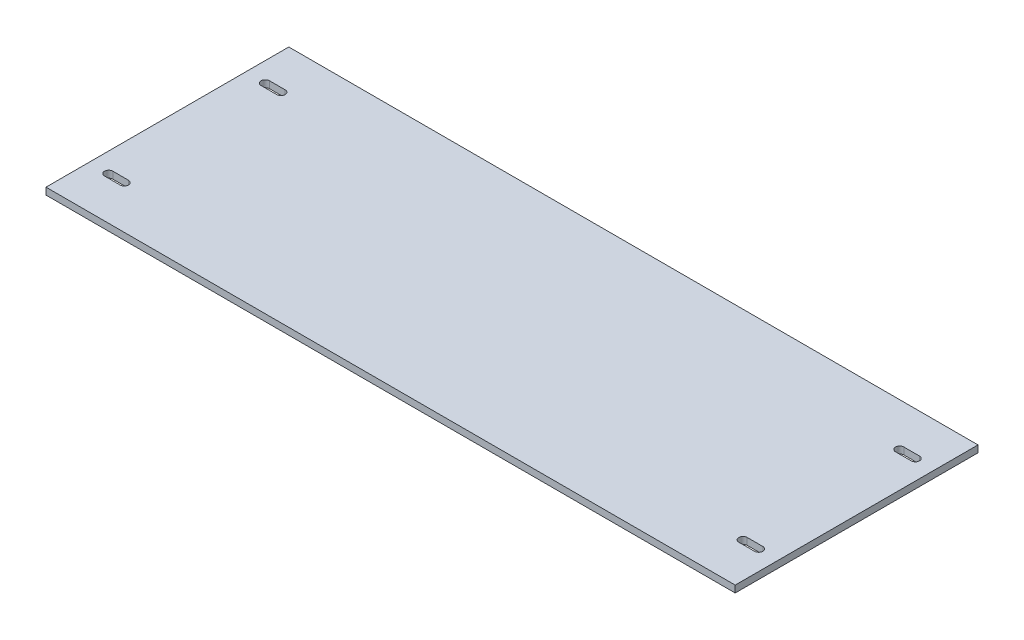
ISO-10303-21;
HEADER;
FILE_DESCRIPTION(('STEP AP214'),'2;1');
FILE_NAME('part.step','',(''),(''),'','','');
FILE_SCHEMA(('AUTOMOTIVE_DESIGN { 1 0 10303 214 1 1 1 1 }'));
ENDSEC;
DATA;
#1=APPLICATION_CONTEXT('core data for automotive mechanical design processes');
#2=APPLICATION_PROTOCOL_DEFINITION('international standard','automotive_design',2000,#1);
#3=PRODUCT_CONTEXT('',#1,'mechanical');
#4=PRODUCT('Part','Part','',(#3));
#5=PRODUCT_RELATED_PRODUCT_CATEGORY('part','',(#4));
#6=PRODUCT_DEFINITION_FORMATION('','',#4);
#7=PRODUCT_DEFINITION_CONTEXT('part definition',#1,'design');
#8=PRODUCT_DEFINITION('design','',#6,#7);
#9=PRODUCT_DEFINITION_SHAPE('','',#8);
#10=(LENGTH_UNIT() NAMED_UNIT(*) SI_UNIT(.MILLI.,.METRE.));
#11=(NAMED_UNIT(*) PLANE_ANGLE_UNIT() SI_UNIT($,.RADIAN.));
#12=(NAMED_UNIT(*) SI_UNIT($,.STERADIAN.) SOLID_ANGLE_UNIT());
#13=UNCERTAINTY_MEASURE_WITH_UNIT(LENGTH_MEASURE(1.E-05),#10,'distance_accuracy_value','');
#14=(GEOMETRIC_REPRESENTATION_CONTEXT(3) GLOBAL_UNCERTAINTY_ASSIGNED_CONTEXT((#13)) GLOBAL_UNIT_ASSIGNED_CONTEXT((#10,
#11,#12)) REPRESENTATION_CONTEXT('',''));
#15=CARTESIAN_POINT('',(0.,0.,0.));
#16=DIRECTION('',(0.,0.,1.));
#17=DIRECTION('',(1.,0.,0.));
#18=AXIS2_PLACEMENT_3D('',#15,#16,#17);
#19=CARTESIAN_POINT('',(0.,5.588,0.));
#20=DIRECTION('',(0.,-1.,0.));
#21=DIRECTION('',(0.,0.,-1.));
#22=AXIS2_PLACEMENT_3D('',#19,#20,#21);
#23=PLANE('',#22);
#24=CARTESIAN_POINT('',(542.925,5.588,-161.925));
#25=DIRECTION('',(0.,1.,0.));
#26=DIRECTION('',(0.,0.,1.));
#27=AXIS2_PLACEMENT_3D('',#24,#25,#26);
#28=CIRCLE('',#27,3.3782);
#29=CARTESIAN_POINT('',(542.925,5.588,-158.5468));
#30=VERTEX_POINT('',#29);
#31=CARTESIAN_POINT('',(542.925,5.588,-165.3032));
#32=VERTEX_POINT('',#31);
#33=EDGE_CURVE('E206',#30,#32,#28,.T.);
#34=ORIENTED_EDGE('',*,*,#33,.F.);
#35=DIRECTION('',(1.,0.,0.));
#36=VECTOR('',#35,1.);
#37=CARTESIAN_POINT('',(542.925,5.588,-158.5468));
#38=LINE('',#37,#36);
#39=CARTESIAN_POINT('',(530.225,5.588,-158.5468));
#40=VERTEX_POINT('',#39);
#41=EDGE_CURVE('E214',#40,#30,#38,.T.);
#42=ORIENTED_EDGE('',*,*,#41,.F.);
#43=CARTESIAN_POINT('',(530.225,5.588,-161.925));
#44=DIRECTION('',(0.,1.,0.));
#45=DIRECTION('',(0.,0.,1.));
#46=AXIS2_PLACEMENT_3D('',#43,#44,#45);
#47=CIRCLE('',#46,3.3782);
#48=CARTESIAN_POINT('',(530.225,5.588,-165.3032));
#49=VERTEX_POINT('',#48);
#50=EDGE_CURVE('E211',#49,#40,#47,.T.);
#51=ORIENTED_EDGE('',*,*,#50,.F.);
#52=DIRECTION('',(-1.,0.,0.));
#53=VECTOR('',#52,1.);
#54=CARTESIAN_POINT('',(542.925,5.588,-165.3032));
#55=LINE('',#54,#53);
#56=EDGE_CURVE('E208',#32,#49,#55,.T.);
#57=ORIENTED_EDGE('',*,*,#56,.F.);
#58=EDGE_LOOP('',(#34,#42,#51,#57));
#59=FACE_BOUND('',#58,.T.);
#60=CARTESIAN_POINT('',(15.875,5.588,-34.925));
#61=DIRECTION('',(0.,1.,0.));
#62=DIRECTION('',(0.,0.,1.));
#63=AXIS2_PLACEMENT_3D('',#60,#61,#62);
#64=CIRCLE('',#63,3.3782);
#65=CARTESIAN_POINT('',(15.875,5.588,-38.3032));
#66=VERTEX_POINT('',#65);
#67=CARTESIAN_POINT('',(15.875,5.588,-31.5468));
#68=VERTEX_POINT('',#67);
#69=EDGE_CURVE('E268',#66,#68,#64,.T.);
#70=ORIENTED_EDGE('',*,*,#69,.F.);
#71=DIRECTION('',(-1.,0.,0.));
#72=VECTOR('',#71,1.);
#73=CARTESIAN_POINT('',(15.875,5.588,-38.3032));
#74=LINE('',#73,#72);
#75=CARTESIAN_POINT('',(28.575,5.588,-38.3032));
#76=VERTEX_POINT('',#75);
#77=EDGE_CURVE('E276',#76,#66,#74,.T.);
#78=ORIENTED_EDGE('',*,*,#77,.F.);
#79=CARTESIAN_POINT('',(28.575,5.588,-34.925));
#80=DIRECTION('',(0.,1.,0.));
#81=DIRECTION('',(0.,0.,1.));
#82=AXIS2_PLACEMENT_3D('',#79,#80,#81);
#83=CIRCLE('',#82,3.3782);
#84=CARTESIAN_POINT('',(28.575,5.588,-31.5468));
#85=VERTEX_POINT('',#84);
#86=EDGE_CURVE('E273',#85,#76,#83,.T.);
#87=ORIENTED_EDGE('',*,*,#86,.F.);
#88=DIRECTION('',(1.,0.,0.));
#89=VECTOR('',#88,1.);
#90=CARTESIAN_POINT('',(15.875,5.588,-31.5468));
#91=LINE('',#90,#89);
#92=EDGE_CURVE('E270',#68,#85,#91,.T.);
#93=ORIENTED_EDGE('',*,*,#92,.F.);
#94=EDGE_LOOP('',(#70,#78,#87,#93));
#95=FACE_BOUND('',#94,.T.);
#96=DIRECTION('',(0.,0.,1.));
#97=VECTOR('',#96,1.);
#98=CARTESIAN_POINT('',(0.,5.588,0.));
#99=LINE('',#98,#97);
#100=CARTESIAN_POINT('',(0.,5.588,-196.85));
#101=VERTEX_POINT('',#100);
#102=CARTESIAN_POINT('',(0.,5.588,0.));
#103=VERTEX_POINT('',#102);
#104=EDGE_CURVE('E299',#101,#103,#99,.T.);
#105=ORIENTED_EDGE('',*,*,#104,.T.);
#106=DIRECTION('',(1.,0.,0.));
#107=VECTOR('',#106,1.);
#108=CARTESIAN_POINT('',(0.,5.588,0.));
#109=LINE('',#108,#107);
#110=CARTESIAN_POINT('',(558.8,5.588,0.));
#111=VERTEX_POINT('',#110);
#112=EDGE_CURVE('E302',#103,#111,#109,.T.);
#113=ORIENTED_EDGE('',*,*,#112,.T.);
#114=DIRECTION('',(0.,0.,-1.));
#115=VECTOR('',#114,1.);
#116=CARTESIAN_POINT('',(558.8,5.588,0.));
#117=LINE('',#116,#115);
#118=CARTESIAN_POINT('',(558.8,5.588,-196.85));
#119=VERTEX_POINT('',#118);
#120=EDGE_CURVE('E305',#111,#119,#117,.T.);
#121=ORIENTED_EDGE('',*,*,#120,.T.);
#122=DIRECTION('',(-1.,0.,0.));
#123=VECTOR('',#122,1.);
#124=CARTESIAN_POINT('',(0.,5.588,-196.85));
#125=LINE('',#124,#123);
#126=EDGE_CURVE('E307',#119,#101,#125,.T.);
#127=ORIENTED_EDGE('',*,*,#126,.T.);
#128=EDGE_LOOP('',(#105,#113,#121,#127));
#129=FACE_BOUND('',#128,.T.);
#130=CARTESIAN_POINT('',(15.875,5.588,-161.925));
#131=DIRECTION('',(0.,1.,0.));
#132=DIRECTION('',(0.,0.,1.));
#133=AXIS2_PLACEMENT_3D('',#130,#131,#132);
#134=CIRCLE('',#133,3.3782);
#135=CARTESIAN_POINT('',(15.875,5.588,-165.3032));
#136=VERTEX_POINT('',#135);
#137=CARTESIAN_POINT('',(15.875,5.588,-158.5468));
#138=VERTEX_POINT('',#137);
#139=EDGE_CURVE('E237',#136,#138,#134,.T.);
#140=ORIENTED_EDGE('',*,*,#139,.F.);
#141=DIRECTION('',(-1.,0.,0.));
#142=VECTOR('',#141,1.);
#143=CARTESIAN_POINT('',(15.875,5.588,-165.3032));
#144=LINE('',#143,#142);
#145=CARTESIAN_POINT('',(28.575,5.588,-165.3032));
#146=VERTEX_POINT('',#145);
#147=EDGE_CURVE('E245',#146,#136,#144,.T.);
#148=ORIENTED_EDGE('',*,*,#147,.F.);
#149=CARTESIAN_POINT('',(28.575,5.588,-161.925));
#150=DIRECTION('',(0.,1.,0.));
#151=DIRECTION('',(0.,0.,1.));
#152=AXIS2_PLACEMENT_3D('',#149,#150,#151);
#153=CIRCLE('',#152,3.3782);
#154=CARTESIAN_POINT('',(28.575,5.588,-158.5468));
#155=VERTEX_POINT('',#154);
#156=EDGE_CURVE('E242',#155,#146,#153,.T.);
#157=ORIENTED_EDGE('',*,*,#156,.F.);
#158=DIRECTION('',(1.,0.,0.));
#159=VECTOR('',#158,1.);
#160=CARTESIAN_POINT('',(15.875,5.588,-158.5468));
#161=LINE('',#160,#159);
#162=EDGE_CURVE('E239',#138,#155,#161,.T.);
#163=ORIENTED_EDGE('',*,*,#162,.F.);
#164=EDGE_LOOP('',(#140,#148,#157,#163));
#165=FACE_BOUND('',#164,.T.);
#166=CARTESIAN_POINT('',(542.925,5.588,-34.925));
#167=DIRECTION('',(0.,1.,0.));
#168=DIRECTION('',(0.,0.,1.));
#169=AXIS2_PLACEMENT_3D('',#166,#167,#168);
#170=CIRCLE('',#169,3.37819999999999);
#171=CARTESIAN_POINT('',(542.925,5.588,-31.5468));
#172=VERTEX_POINT('',#171);
#173=CARTESIAN_POINT('',(542.925,5.588,-38.3032));
#174=VERTEX_POINT('',#173);
#175=EDGE_CURVE('E170',#172,#174,#170,.T.);
#176=ORIENTED_EDGE('',*,*,#175,.F.);
#177=DIRECTION('',(1.,0.,0.));
#178=VECTOR('',#177,1.);
#179=CARTESIAN_POINT('',(542.925,5.588,-31.5468));
#180=LINE('',#179,#178);
#181=CARTESIAN_POINT('',(530.225,5.588,-31.5468));
#182=VERTEX_POINT('',#181);
#183=EDGE_CURVE('E192',#182,#172,#180,.T.);
#184=ORIENTED_EDGE('',*,*,#183,.F.);
#185=CARTESIAN_POINT('',(530.225,5.588,-34.925));
#186=DIRECTION('',(0.,1.,0.));
#187=DIRECTION('',(0.,0.,1.));
#188=AXIS2_PLACEMENT_3D('',#185,#186,#187);
#189=CIRCLE('',#188,3.37819999999999);
#190=CARTESIAN_POINT('',(530.225,5.588,-38.3032));
#191=VERTEX_POINT('',#190);
#192=EDGE_CURVE('E190',#191,#182,#189,.T.);
#193=ORIENTED_EDGE('',*,*,#192,.F.);
#194=DIRECTION('',(-1.,0.,0.));
#195=VECTOR('',#194,1.);
#196=CARTESIAN_POINT('',(542.925,5.588,-38.3032));
#197=LINE('',#196,#195);
#198=EDGE_CURVE('E178',#174,#191,#197,.T.);
#199=ORIENTED_EDGE('',*,*,#198,.F.);
#200=EDGE_LOOP('',(#176,#184,#193,#199));
#201=FACE_BOUND('',#200,.T.);
#202=ADVANCED_FACE('F33',(#59,#95,#129,#165,#201),#23,.F.);
#203=CARTESIAN_POINT('',(0.,0.,0.));
#204=DIRECTION('',(0.,-1.,0.));
#205=DIRECTION('',(0.,0.,-1.));
#206=AXIS2_PLACEMENT_3D('',#203,#204,#205);
#207=PLANE('',#206);
#208=DIRECTION('',(0.,0.,1.));
#209=VECTOR('',#208,1.);
#210=CARTESIAN_POINT('',(0.,0.,0.));
#211=LINE('',#210,#209);
#212=CARTESIAN_POINT('',(0.,0.,-196.85));
#213=VERTEX_POINT('',#212);
#214=CARTESIAN_POINT('',(0.,0.,0.));
#215=VERTEX_POINT('',#214);
#216=EDGE_CURVE('E298',#213,#215,#211,.T.);
#217=ORIENTED_EDGE('',*,*,#216,.F.);
#218=DIRECTION('',(-1.,0.,0.));
#219=VECTOR('',#218,1.);
#220=CARTESIAN_POINT('',(0.,0.,-196.85));
#221=LINE('',#220,#219);
#222=CARTESIAN_POINT('',(558.8,0.,-196.85));
#223=VERTEX_POINT('',#222);
#224=EDGE_CURVE('E303',#223,#213,#221,.T.);
#225=ORIENTED_EDGE('',*,*,#224,.F.);
#226=DIRECTION('',(0.,0.,-1.));
#227=VECTOR('',#226,1.);
#228=CARTESIAN_POINT('',(558.8,0.,0.));
#229=LINE('',#228,#227);
#230=CARTESIAN_POINT('',(558.8,0.,0.));
#231=VERTEX_POINT('',#230);
#232=EDGE_CURVE('E314',#231,#223,#229,.T.);
#233=ORIENTED_EDGE('',*,*,#232,.F.);
#234=DIRECTION('',(1.,0.,0.));
#235=VECTOR('',#234,1.);
#236=CARTESIAN_POINT('',(0.,0.,0.));
#237=LINE('',#236,#235);
#238=EDGE_CURVE('E312',#215,#231,#237,.T.);
#239=ORIENTED_EDGE('',*,*,#238,.F.);
#240=EDGE_LOOP('',(#217,#225,#233,#239));
#241=FACE_BOUND('',#240,.T.);
#242=DIRECTION('',(-1.,0.,0.));
#243=VECTOR('',#242,1.);
#244=CARTESIAN_POINT('',(15.875,0.,-38.3032));
#245=LINE('',#244,#243);
#246=CARTESIAN_POINT('',(28.575,0.,-38.3032));
#247=VERTEX_POINT('',#246);
#248=CARTESIAN_POINT('',(15.875,0.,-38.3032));
#249=VERTEX_POINT('',#248);
#250=EDGE_CURVE('E271',#247,#249,#245,.T.);
#251=ORIENTED_EDGE('',*,*,#250,.T.);
#252=CARTESIAN_POINT('',(15.875,0.,-34.925));
#253=DIRECTION('',(0.,1.,0.));
#254=DIRECTION('',(0.,0.,1.));
#255=AXIS2_PLACEMENT_3D('',#252,#253,#254);
#256=CIRCLE('',#255,3.3782);
#257=CARTESIAN_POINT('',(15.875,0.,-31.5468));
#258=VERTEX_POINT('',#257);
#259=EDGE_CURVE('E267',#249,#258,#256,.T.);
#260=ORIENTED_EDGE('',*,*,#259,.T.);
#261=DIRECTION('',(1.,0.,0.));
#262=VECTOR('',#261,1.);
#263=CARTESIAN_POINT('',(15.875,0.,-31.5468));
#264=LINE('',#263,#262);
#265=CARTESIAN_POINT('',(28.575,0.,-31.5468));
#266=VERTEX_POINT('',#265);
#267=EDGE_CURVE('E281',#258,#266,#264,.T.);
#268=ORIENTED_EDGE('',*,*,#267,.T.);
#269=CARTESIAN_POINT('',(28.575,0.,-34.925));
#270=DIRECTION('',(0.,1.,0.));
#271=DIRECTION('',(0.,0.,1.));
#272=AXIS2_PLACEMENT_3D('',#269,#270,#271);
#273=CIRCLE('',#272,3.3782);
#274=EDGE_CURVE('E284',#266,#247,#273,.T.);
#275=ORIENTED_EDGE('',*,*,#274,.T.);
#276=EDGE_LOOP('',(#251,#260,#268,#275));
#277=FACE_BOUND('',#276,.T.);
#278=DIRECTION('',(-1.,0.,0.));
#279=VECTOR('',#278,1.);
#280=CARTESIAN_POINT('',(15.875,0.,-165.3032));
#281=LINE('',#280,#279);
#282=CARTESIAN_POINT('',(28.575,0.,-165.3032));
#283=VERTEX_POINT('',#282);
#284=CARTESIAN_POINT('',(15.875,0.,-165.3032));
#285=VERTEX_POINT('',#284);
#286=EDGE_CURVE('E240',#283,#285,#281,.T.);
#287=ORIENTED_EDGE('',*,*,#286,.T.);
#288=CARTESIAN_POINT('',(15.875,0.,-161.925));
#289=DIRECTION('',(0.,1.,0.));
#290=DIRECTION('',(0.,0.,1.));
#291=AXIS2_PLACEMENT_3D('',#288,#289,#290);
#292=CIRCLE('',#291,3.3782);
#293=CARTESIAN_POINT('',(15.875,0.,-158.5468));
#294=VERTEX_POINT('',#293);
#295=EDGE_CURVE('E236',#285,#294,#292,.T.);
#296=ORIENTED_EDGE('',*,*,#295,.T.);
#297=DIRECTION('',(1.,0.,0.));
#298=VECTOR('',#297,1.);
#299=CARTESIAN_POINT('',(15.875,0.,-158.5468));
#300=LINE('',#299,#298);
#301=CARTESIAN_POINT('',(28.575,0.,-158.5468));
#302=VERTEX_POINT('',#301);
#303=EDGE_CURVE('E250',#294,#302,#300,.T.);
#304=ORIENTED_EDGE('',*,*,#303,.T.);
#305=CARTESIAN_POINT('',(28.575,0.,-161.925));
#306=DIRECTION('',(0.,1.,0.));
#307=DIRECTION('',(0.,0.,1.));
#308=AXIS2_PLACEMENT_3D('',#305,#306,#307);
#309=CIRCLE('',#308,3.3782);
#310=EDGE_CURVE('E253',#302,#283,#309,.T.);
#311=ORIENTED_EDGE('',*,*,#310,.T.);
#312=EDGE_LOOP('',(#287,#296,#304,#311));
#313=FACE_BOUND('',#312,.T.);
#314=DIRECTION('',(1.,0.,0.));
#315=VECTOR('',#314,1.);
#316=CARTESIAN_POINT('',(542.925,0.,-158.5468));
#317=LINE('',#316,#315);
#318=CARTESIAN_POINT('',(530.225,0.,-158.5468));
#319=VERTEX_POINT('',#318);
#320=CARTESIAN_POINT('',(542.925,0.,-158.5468));
#321=VERTEX_POINT('',#320);
#322=EDGE_CURVE('E209',#319,#321,#317,.T.);
#323=ORIENTED_EDGE('',*,*,#322,.T.);
#324=CARTESIAN_POINT('',(542.925,0.,-161.925));
#325=DIRECTION('',(0.,1.,0.));
#326=DIRECTION('',(0.,0.,1.));
#327=AXIS2_PLACEMENT_3D('',#324,#325,#326);
#328=CIRCLE('',#327,3.3782);
#329=CARTESIAN_POINT('',(542.925,0.,-165.3032));
#330=VERTEX_POINT('',#329);
#331=EDGE_CURVE('E186',#321,#330,#328,.T.);
#332=ORIENTED_EDGE('',*,*,#331,.T.);
#333=DIRECTION('',(-1.,0.,0.));
#334=VECTOR('',#333,1.);
#335=CARTESIAN_POINT('',(542.925,0.,-165.3032));
#336=LINE('',#335,#334);
#337=CARTESIAN_POINT('',(530.225,0.,-165.3032));
#338=VERTEX_POINT('',#337);
#339=EDGE_CURVE('E219',#330,#338,#336,.T.);
#340=ORIENTED_EDGE('',*,*,#339,.T.);
#341=CARTESIAN_POINT('',(530.225,0.,-161.925));
#342=DIRECTION('',(0.,1.,0.));
#343=DIRECTION('',(0.,0.,1.));
#344=AXIS2_PLACEMENT_3D('',#341,#342,#343);
#345=CIRCLE('',#344,3.3782);
#346=EDGE_CURVE('E222',#338,#319,#345,.T.);
#347=ORIENTED_EDGE('',*,*,#346,.T.);
#348=EDGE_LOOP('',(#323,#332,#340,#347));
#349=FACE_BOUND('',#348,.T.);
#350=DIRECTION('',(1.,0.,0.));
#351=VECTOR('',#350,1.);
#352=CARTESIAN_POINT('',(542.925,0.,-31.5468));
#353=LINE('',#352,#351);
#354=CARTESIAN_POINT('',(530.225,0.,-31.5468));
#355=VERTEX_POINT('',#354);
#356=CARTESIAN_POINT('',(542.925,0.,-31.5468));
#357=VERTEX_POINT('',#356);
#358=EDGE_CURVE('E179',#355,#357,#353,.T.);
#359=ORIENTED_EDGE('',*,*,#358,.T.);
#360=CARTESIAN_POINT('',(542.925,0.,-34.925));
#361=DIRECTION('',(0.,1.,0.));
#362=DIRECTION('',(0.,0.,1.));
#363=AXIS2_PLACEMENT_3D('',#360,#361,#362);
#364=CIRCLE('',#363,3.37819999999999);
#365=CARTESIAN_POINT('',(542.925,0.,-38.3032));
#366=VERTEX_POINT('',#365);
#367=EDGE_CURVE('E56',#357,#366,#364,.T.);
#368=ORIENTED_EDGE('',*,*,#367,.T.);
#369=DIRECTION('',(-1.,0.,0.));
#370=VECTOR('',#369,1.);
#371=CARTESIAN_POINT('',(542.925,0.,-38.3032));
#372=LINE('',#371,#370);
#373=CARTESIAN_POINT('',(530.225,0.,-38.3032));
#374=VERTEX_POINT('',#373);
#375=EDGE_CURVE('E185',#366,#374,#372,.T.);
#376=ORIENTED_EDGE('',*,*,#375,.T.);
#377=CARTESIAN_POINT('',(530.225,0.,-34.925));
#378=DIRECTION('',(0.,1.,0.));
#379=DIRECTION('',(0.,0.,1.));
#380=AXIS2_PLACEMENT_3D('',#377,#378,#379);
#381=CIRCLE('',#380,3.37819999999999);
#382=EDGE_CURVE('E198',#374,#355,#381,.T.);
#383=ORIENTED_EDGE('',*,*,#382,.T.);
#384=EDGE_LOOP('',(#359,#368,#376,#383));
#385=FACE_BOUND('',#384,.T.);
#386=ADVANCED_FACE('F332',(#241,#277,#313,#349,#385),#207,.T.);
#387=CARTESIAN_POINT('',(0.,5.588,0.));
#388=DIRECTION('',(1.,0.,0.));
#389=DIRECTION('',(0.,0.,-1.));
#390=AXIS2_PLACEMENT_3D('',#387,#388,#389);
#391=PLANE('',#390);
#392=ORIENTED_EDGE('',*,*,#216,.T.);
#393=DIRECTION('',(0.,-1.,0.));
#394=VECTOR('',#393,1.);
#395=CARTESIAN_POINT('',(0.,5.588,0.));
#396=LINE('',#395,#394);
#397=EDGE_CURVE('E11',#103,#215,#396,.T.);
#398=ORIENTED_EDGE('',*,*,#397,.F.);
#399=ORIENTED_EDGE('',*,*,#104,.F.);
#400=DIRECTION('',(0.,-1.,0.));
#401=VECTOR('',#400,1.);
#402=CARTESIAN_POINT('',(0.,5.588,-196.85));
#403=LINE('',#402,#401);
#404=EDGE_CURVE('E309',#101,#213,#403,.T.);
#405=ORIENTED_EDGE('',*,*,#404,.T.);
#406=EDGE_LOOP('',(#392,#398,#399,#405));
#407=FACE_BOUND('',#406,.T.);
#408=ADVANCED_FACE('F35',(#407),#391,.F.);
#409=CARTESIAN_POINT('',(0.,5.588,0.));
#410=DIRECTION('',(0.,0.,-1.));
#411=DIRECTION('',(-1.,0.,0.));
#412=AXIS2_PLACEMENT_3D('',#409,#410,#411);
#413=PLANE('',#412);
#414=ORIENTED_EDGE('',*,*,#238,.T.);
#415=DIRECTION('',(0.,-1.,0.));
#416=VECTOR('',#415,1.);
#417=CARTESIAN_POINT('',(558.8,5.588,0.));
#418=LINE('',#417,#416);
#419=EDGE_CURVE('E41',#111,#231,#418,.T.);
#420=ORIENTED_EDGE('',*,*,#419,.F.);
#421=ORIENTED_EDGE('',*,*,#112,.F.);
#422=ORIENTED_EDGE('',*,*,#397,.T.);
#423=EDGE_LOOP('',(#414,#420,#421,#422));
#424=FACE_BOUND('',#423,.T.);
#425=ADVANCED_FACE('F343',(#424),#413,.F.);
#426=CARTESIAN_POINT('',(558.8,5.588,0.));
#427=DIRECTION('',(-1.,0.,0.));
#428=DIRECTION('',(0.,0.,1.));
#429=AXIS2_PLACEMENT_3D('',#426,#427,#428);
#430=PLANE('',#429);
#431=ORIENTED_EDGE('',*,*,#232,.T.);
#432=DIRECTION('',(0.,-1.,0.));
#433=VECTOR('',#432,1.);
#434=CARTESIAN_POINT('',(558.8,5.588,-196.85));
#435=LINE('',#434,#433);
#436=EDGE_CURVE('E319',#119,#223,#435,.T.);
#437=ORIENTED_EDGE('',*,*,#436,.F.);
#438=ORIENTED_EDGE('',*,*,#120,.F.);
#439=ORIENTED_EDGE('',*,*,#419,.T.);
#440=EDGE_LOOP('',(#431,#437,#438,#439));
#441=FACE_BOUND('',#440,.T.);
#442=ADVANCED_FACE('F326',(#441),#430,.F.);
#443=CARTESIAN_POINT('',(0.,5.588,-196.85));
#444=DIRECTION('',(0.,0.,1.));
#445=DIRECTION('',(1.,0.,0.));
#446=AXIS2_PLACEMENT_3D('',#443,#444,#445);
#447=PLANE('',#446);
#448=ORIENTED_EDGE('',*,*,#224,.T.);
#449=ORIENTED_EDGE('',*,*,#404,.F.);
#450=ORIENTED_EDGE('',*,*,#126,.F.);
#451=ORIENTED_EDGE('',*,*,#436,.T.);
#452=EDGE_LOOP('',(#448,#449,#450,#451));
#453=FACE_BOUND('',#452,.T.);
#454=ADVANCED_FACE('F336',(#453),#447,.F.);
#455=CARTESIAN_POINT('',(15.875,5.588,-34.925));
#456=DIRECTION('',(0.,-1.,0.));
#457=DIRECTION('',(0.,0.,-1.));
#458=AXIS2_PLACEMENT_3D('',#455,#456,#457);
#459=CYLINDRICAL_SURFACE('',#458,3.3782);
#460=ORIENTED_EDGE('',*,*,#259,.F.);
#461=DIRECTION('',(0.,-1.,0.));
#462=VECTOR('',#461,1.);
#463=CARTESIAN_POINT('',(15.875,5.588,-38.3032));
#464=LINE('',#463,#462);
#465=EDGE_CURVE('E278',#66,#249,#464,.T.);
#466=ORIENTED_EDGE('',*,*,#465,.F.);
#467=ORIENTED_EDGE('',*,*,#69,.T.);
#468=DIRECTION('',(0.,-1.,0.));
#469=VECTOR('',#468,1.);
#470=CARTESIAN_POINT('',(15.875,5.588,-31.5468));
#471=LINE('',#470,#469);
#472=EDGE_CURVE('E295',#68,#258,#471,.T.);
#473=ORIENTED_EDGE('',*,*,#472,.T.);
#474=EDGE_LOOP('',(#460,#466,#467,#473));
#475=FACE_BOUND('',#474,.T.);
#476=ADVANCED_FACE('F360',(#475),#459,.F.);
#477=CARTESIAN_POINT('',(15.875,5.588,-31.5468));
#478=DIRECTION('',(0.,0.,-1.));
#479=DIRECTION('',(-1.,0.,0.));
#480=AXIS2_PLACEMENT_3D('',#477,#478,#479);
#481=PLANE('',#480);
#482=ORIENTED_EDGE('',*,*,#267,.F.);
#483=ORIENTED_EDGE('',*,*,#472,.F.);
#484=ORIENTED_EDGE('',*,*,#92,.T.);
#485=DIRECTION('',(0.,-1.,0.));
#486=VECTOR('',#485,1.);
#487=CARTESIAN_POINT('',(28.575,5.588,-31.5468));
#488=LINE('',#487,#486);
#489=EDGE_CURVE('E293',#85,#266,#488,.T.);
#490=ORIENTED_EDGE('',*,*,#489,.T.);
#491=EDGE_LOOP('',(#482,#483,#484,#490));
#492=FACE_BOUND('',#491,.T.);
#493=ADVANCED_FACE('F367',(#492),#481,.T.);
#494=CARTESIAN_POINT('',(28.575,5.588,-34.925));
#495=DIRECTION('',(0.,-1.,0.));
#496=DIRECTION('',(0.,0.,-1.));
#497=AXIS2_PLACEMENT_3D('',#494,#495,#496);
#498=CYLINDRICAL_SURFACE('',#497,3.3782);
#499=ORIENTED_EDGE('',*,*,#274,.F.);
#500=ORIENTED_EDGE('',*,*,#489,.F.);
#501=ORIENTED_EDGE('',*,*,#86,.T.);
#502=DIRECTION('',(0.,-1.,0.));
#503=VECTOR('',#502,1.);
#504=CARTESIAN_POINT('',(28.575,5.588,-38.3032));
#505=LINE('',#504,#503);
#506=EDGE_CURVE('E291',#76,#247,#505,.T.);
#507=ORIENTED_EDGE('',*,*,#506,.T.);
#508=EDGE_LOOP('',(#499,#500,#501,#507));
#509=FACE_BOUND('',#508,.T.);
#510=ADVANCED_FACE('F372',(#509),#498,.F.);
#511=CARTESIAN_POINT('',(15.875,5.588,-38.3032));
#512=DIRECTION('',(0.,0.,1.));
#513=DIRECTION('',(1.,0.,0.));
#514=AXIS2_PLACEMENT_3D('',#511,#512,#513);
#515=PLANE('',#514);
#516=ORIENTED_EDGE('',*,*,#250,.F.);
#517=ORIENTED_EDGE('',*,*,#506,.F.);
#518=ORIENTED_EDGE('',*,*,#77,.T.);
#519=ORIENTED_EDGE('',*,*,#465,.T.);
#520=EDGE_LOOP('',(#516,#517,#518,#519));
#521=FACE_BOUND('',#520,.T.);
#522=ADVANCED_FACE('F379',(#521),#515,.T.);
#523=CARTESIAN_POINT('',(15.875,5.588,-161.925));
#524=DIRECTION('',(0.,-1.,0.));
#525=DIRECTION('',(0.,0.,-1.));
#526=AXIS2_PLACEMENT_3D('',#523,#524,#525);
#527=CYLINDRICAL_SURFACE('',#526,3.3782);
#528=ORIENTED_EDGE('',*,*,#295,.F.);
#529=DIRECTION('',(0.,-1.,0.));
#530=VECTOR('',#529,1.);
#531=CARTESIAN_POINT('',(15.875,5.588,-165.3032));
#532=LINE('',#531,#530);
#533=EDGE_CURVE('E247',#136,#285,#532,.T.);
#534=ORIENTED_EDGE('',*,*,#533,.F.);
#535=ORIENTED_EDGE('',*,*,#139,.T.);
#536=DIRECTION('',(0.,-1.,0.));
#537=VECTOR('',#536,1.);
#538=CARTESIAN_POINT('',(15.875,5.588,-158.5468));
#539=LINE('',#538,#537);
#540=EDGE_CURVE('E264',#138,#294,#539,.T.);
#541=ORIENTED_EDGE('',*,*,#540,.T.);
#542=EDGE_LOOP('',(#528,#534,#535,#541));
#543=FACE_BOUND('',#542,.T.);
#544=ADVANCED_FACE('F392',(#543),#527,.F.);
#545=CARTESIAN_POINT('',(15.875,5.588,-158.5468));
#546=DIRECTION('',(0.,0.,-1.));
#547=DIRECTION('',(-1.,0.,0.));
#548=AXIS2_PLACEMENT_3D('',#545,#546,#547);
#549=PLANE('',#548);
#550=ORIENTED_EDGE('',*,*,#303,.F.);
#551=ORIENTED_EDGE('',*,*,#540,.F.);
#552=ORIENTED_EDGE('',*,*,#162,.T.);
#553=DIRECTION('',(0.,-1.,0.));
#554=VECTOR('',#553,1.);
#555=CARTESIAN_POINT('',(28.575,5.588,-158.5468));
#556=LINE('',#555,#554);
#557=EDGE_CURVE('E262',#155,#302,#556,.T.);
#558=ORIENTED_EDGE('',*,*,#557,.T.);
#559=EDGE_LOOP('',(#550,#551,#552,#558));
#560=FACE_BOUND('',#559,.T.);
#561=ADVANCED_FACE('F397',(#560),#549,.T.);
#562=CARTESIAN_POINT('',(28.575,5.588,-161.925));
#563=DIRECTION('',(0.,-1.,0.));
#564=DIRECTION('',(0.,0.,-1.));
#565=AXIS2_PLACEMENT_3D('',#562,#563,#564);
#566=CYLINDRICAL_SURFACE('',#565,3.3782);
#567=ORIENTED_EDGE('',*,*,#310,.F.);
#568=ORIENTED_EDGE('',*,*,#557,.F.);
#569=ORIENTED_EDGE('',*,*,#156,.T.);
#570=DIRECTION('',(0.,-1.,0.));
#571=VECTOR('',#570,1.);
#572=CARTESIAN_POINT('',(28.575,5.588,-165.3032));
#573=LINE('',#572,#571);
#574=EDGE_CURVE('E260',#146,#283,#573,.T.);
#575=ORIENTED_EDGE('',*,*,#574,.T.);
#576=EDGE_LOOP('',(#567,#568,#569,#575));
#577=FACE_BOUND('',#576,.T.);
#578=ADVANCED_FACE('F401',(#577),#566,.F.);
#579=CARTESIAN_POINT('',(15.875,5.588,-165.3032));
#580=DIRECTION('',(0.,0.,1.));
#581=DIRECTION('',(1.,0.,0.));
#582=AXIS2_PLACEMENT_3D('',#579,#580,#581);
#583=PLANE('',#582);
#584=ORIENTED_EDGE('',*,*,#286,.F.);
#585=ORIENTED_EDGE('',*,*,#574,.F.);
#586=ORIENTED_EDGE('',*,*,#147,.T.);
#587=ORIENTED_EDGE('',*,*,#533,.T.);
#588=EDGE_LOOP('',(#584,#585,#586,#587));
#589=FACE_BOUND('',#588,.T.);
#590=ADVANCED_FACE('F405',(#589),#583,.T.);
#591=CARTESIAN_POINT('',(542.925,5.588,-161.925));
#592=DIRECTION('',(0.,-1.,0.));
#593=DIRECTION('',(0.,0.,-1.));
#594=AXIS2_PLACEMENT_3D('',#591,#592,#593);
#595=CYLINDRICAL_SURFACE('',#594,3.3782);
#596=ORIENTED_EDGE('',*,*,#331,.F.);
#597=DIRECTION('',(0.,-1.,0.));
#598=VECTOR('',#597,1.);
#599=CARTESIAN_POINT('',(542.925,5.588,-158.5468));
#600=LINE('',#599,#598);
#601=EDGE_CURVE('E216',#30,#321,#600,.T.);
#602=ORIENTED_EDGE('',*,*,#601,.F.);
#603=ORIENTED_EDGE('',*,*,#33,.T.);
#604=DIRECTION('',(0.,-1.,0.));
#605=VECTOR('',#604,1.);
#606=CARTESIAN_POINT('',(542.925,5.588,-165.3032));
#607=LINE('',#606,#605);
#608=EDGE_CURVE('E233',#32,#330,#607,.T.);
#609=ORIENTED_EDGE('',*,*,#608,.T.);
#610=EDGE_LOOP('',(#596,#602,#603,#609));
#611=FACE_BOUND('',#610,.T.);
#612=ADVANCED_FACE('F409',(#611),#595,.F.);
#613=CARTESIAN_POINT('',(542.925,5.588,-165.3032));
#614=DIRECTION('',(0.,0.,1.));
#615=DIRECTION('',(1.,0.,0.));
#616=AXIS2_PLACEMENT_3D('',#613,#614,#615);
#617=PLANE('',#616);
#618=ORIENTED_EDGE('',*,*,#339,.F.);
#619=ORIENTED_EDGE('',*,*,#608,.F.);
#620=ORIENTED_EDGE('',*,*,#56,.T.);
#621=DIRECTION('',(0.,-1.,0.));
#622=VECTOR('',#621,1.);
#623=CARTESIAN_POINT('',(530.225,5.588,-165.3032));
#624=LINE('',#623,#622);
#625=EDGE_CURVE('E231',#49,#338,#624,.T.);
#626=ORIENTED_EDGE('',*,*,#625,.T.);
#627=EDGE_LOOP('',(#618,#619,#620,#626));
#628=FACE_BOUND('',#627,.T.);
#629=ADVANCED_FACE('F413',(#628),#617,.T.);
#630=CARTESIAN_POINT('',(530.225,5.588,-161.925));
#631=DIRECTION('',(0.,-1.,0.));
#632=DIRECTION('',(0.,0.,-1.));
#633=AXIS2_PLACEMENT_3D('',#630,#631,#632);
#634=CYLINDRICAL_SURFACE('',#633,3.3782);
#635=ORIENTED_EDGE('',*,*,#346,.F.);
#636=ORIENTED_EDGE('',*,*,#625,.F.);
#637=ORIENTED_EDGE('',*,*,#50,.T.);
#638=DIRECTION('',(0.,-1.,0.));
#639=VECTOR('',#638,1.);
#640=CARTESIAN_POINT('',(530.225,5.588,-158.5468));
#641=LINE('',#640,#639);
#642=EDGE_CURVE('E229',#40,#319,#641,.T.);
#643=ORIENTED_EDGE('',*,*,#642,.T.);
#644=EDGE_LOOP('',(#635,#636,#637,#643));
#645=FACE_BOUND('',#644,.T.);
#646=ADVANCED_FACE('F417',(#645),#634,.F.);
#647=CARTESIAN_POINT('',(542.925,5.588,-158.5468));
#648=DIRECTION('',(0.,0.,-1.));
#649=DIRECTION('',(-1.,0.,0.));
#650=AXIS2_PLACEMENT_3D('',#647,#648,#649);
#651=PLANE('',#650);
#652=ORIENTED_EDGE('',*,*,#322,.F.);
#653=ORIENTED_EDGE('',*,*,#642,.F.);
#654=ORIENTED_EDGE('',*,*,#41,.T.);
#655=ORIENTED_EDGE('',*,*,#601,.T.);
#656=EDGE_LOOP('',(#652,#653,#654,#655));
#657=FACE_BOUND('',#656,.T.);
#658=ADVANCED_FACE('F421',(#657),#651,.T.);
#659=CARTESIAN_POINT('',(542.925,5.588,-34.925));
#660=DIRECTION('',(0.,-1.,0.));
#661=DIRECTION('',(0.,0.,-1.));
#662=AXIS2_PLACEMENT_3D('',#659,#660,#661);
#663=CYLINDRICAL_SURFACE('',#662,3.37819999999999);
#664=ORIENTED_EDGE('',*,*,#367,.F.);
#665=DIRECTION('',(0.,-1.,0.));
#666=VECTOR('',#665,1.);
#667=CARTESIAN_POINT('',(542.925,5.588,-31.5468));
#668=LINE('',#667,#666);
#669=EDGE_CURVE('E174',#172,#357,#668,.T.);
#670=ORIENTED_EDGE('',*,*,#669,.F.);
#671=ORIENTED_EDGE('',*,*,#175,.T.);
#672=DIRECTION('',(0.,-1.,0.));
#673=VECTOR('',#672,1.);
#674=CARTESIAN_POINT('',(542.925,5.588,-38.3032));
#675=LINE('',#674,#673);
#676=EDGE_CURVE('E173',#174,#366,#675,.T.);
#677=ORIENTED_EDGE('',*,*,#676,.T.);
#678=EDGE_LOOP('',(#664,#670,#671,#677));
#679=FACE_BOUND('',#678,.T.);
#680=ADVANCED_FACE('F172',(#679),#663,.F.);
#681=CARTESIAN_POINT('',(542.925,5.588,-38.3032));
#682=DIRECTION('',(0.,0.,1.));
#683=DIRECTION('',(1.,0.,0.));
#684=AXIS2_PLACEMENT_3D('',#681,#682,#683);
#685=PLANE('',#684);
#686=ORIENTED_EDGE('',*,*,#375,.F.);
#687=ORIENTED_EDGE('',*,*,#676,.F.);
#688=ORIENTED_EDGE('',*,*,#198,.T.);
#689=DIRECTION('',(0.,-1.,0.));
#690=VECTOR('',#689,1.);
#691=CARTESIAN_POINT('',(530.225,5.588,-38.3032));
#692=LINE('',#691,#690);
#693=EDGE_CURVE('E187',#191,#374,#692,.T.);
#694=ORIENTED_EDGE('',*,*,#693,.T.);
#695=EDGE_LOOP('',(#686,#687,#688,#694));
#696=FACE_BOUND('',#695,.T.);
#697=ADVANCED_FACE('F182',(#696),#685,.T.);
#698=CARTESIAN_POINT('',(530.225,5.588,-34.925));
#699=DIRECTION('',(0.,-1.,0.));
#700=DIRECTION('',(0.,0.,-1.));
#701=AXIS2_PLACEMENT_3D('',#698,#699,#700);
#702=CYLINDRICAL_SURFACE('',#701,3.37819999999999);
#703=ORIENTED_EDGE('',*,*,#382,.F.);
#704=ORIENTED_EDGE('',*,*,#693,.F.);
#705=ORIENTED_EDGE('',*,*,#192,.T.);
#706=DIRECTION('',(0.,-1.,0.));
#707=VECTOR('',#706,1.);
#708=CARTESIAN_POINT('',(530.225,5.588,-31.5468));
#709=LINE('',#708,#707);
#710=EDGE_CURVE('E48',#182,#355,#709,.T.);
#711=ORIENTED_EDGE('',*,*,#710,.T.);
#712=EDGE_LOOP('',(#703,#704,#705,#711));
#713=FACE_BOUND('',#712,.T.);
#714=ADVANCED_FACE('F430',(#713),#702,.F.);
#715=CARTESIAN_POINT('',(542.925,5.588,-31.5468));
#716=DIRECTION('',(0.,0.,-1.));
#717=DIRECTION('',(-1.,0.,0.));
#718=AXIS2_PLACEMENT_3D('',#715,#716,#717);
#719=PLANE('',#718);
#720=ORIENTED_EDGE('',*,*,#358,.F.);
#721=ORIENTED_EDGE('',*,*,#710,.F.);
#722=ORIENTED_EDGE('',*,*,#183,.T.);
#723=ORIENTED_EDGE('',*,*,#669,.T.);
#724=EDGE_LOOP('',(#720,#721,#722,#723));
#725=FACE_BOUND('',#724,.T.);
#726=ADVANCED_FACE('F433',(#725),#719,.T.);
#727=CLOSED_SHELL('',(#202,#386,#408,#425,#442,#454,#476,#493,#510,#522,#544,#561,#578,#590,
#612,#629,#646,#658,#680,#697,#714,#726));
#728=MANIFOLD_SOLID_BREP('B2',#727);
#729=ADVANCED_BREP_SHAPE_REPRESENTATION('',(#18,#728),#14);
#730=SHAPE_DEFINITION_REPRESENTATION(#9,#729);
ENDSEC;
END-ISO-10303-21;
